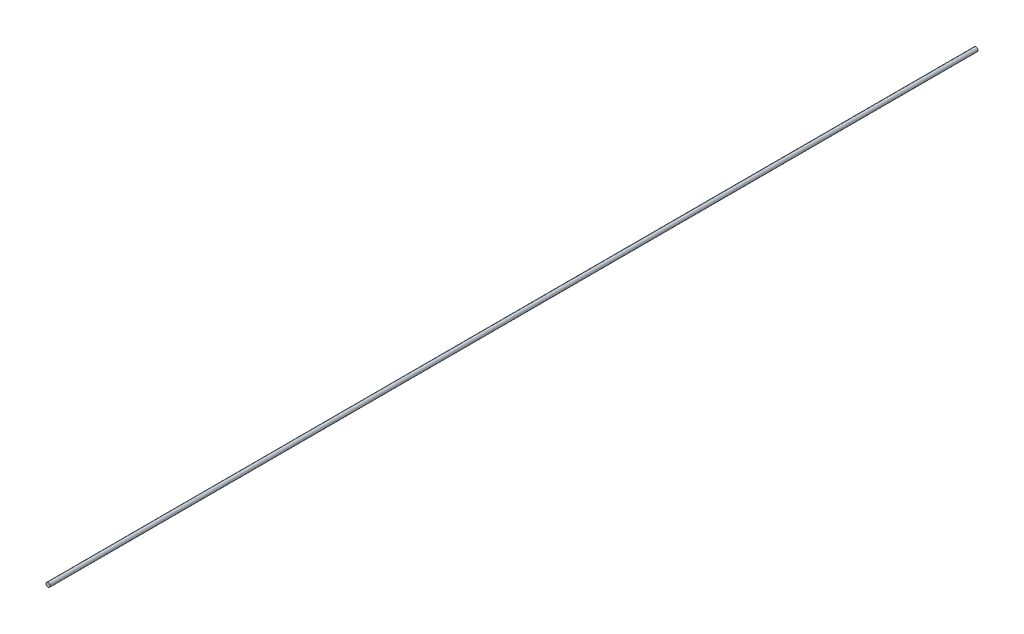
ISO-10303-21;
HEADER;
FILE_DESCRIPTION(('STEP AP214'),'2;1');
FILE_NAME('part.step','',(''),(''),'','','');
FILE_SCHEMA(('AUTOMOTIVE_DESIGN { 1 0 10303 214 1 1 1 1 }'));
ENDSEC;
DATA;
#1=APPLICATION_CONTEXT('core data for automotive mechanical design processes');
#2=APPLICATION_PROTOCOL_DEFINITION('international standard','automotive_design',2000,#1);
#3=PRODUCT_CONTEXT('',#1,'mechanical');
#4=PRODUCT('Part','Part','',(#3));
#5=PRODUCT_RELATED_PRODUCT_CATEGORY('part','',(#4));
#6=PRODUCT_DEFINITION_FORMATION('','',#4);
#7=PRODUCT_DEFINITION_CONTEXT('part definition',#1,'design');
#8=PRODUCT_DEFINITION('design','',#6,#7);
#9=PRODUCT_DEFINITION_SHAPE('','',#8);
#10=(LENGTH_UNIT() NAMED_UNIT(*) SI_UNIT(.MILLI.,.METRE.));
#11=(NAMED_UNIT(*) PLANE_ANGLE_UNIT() SI_UNIT($,.RADIAN.));
#12=(NAMED_UNIT(*) SI_UNIT($,.STERADIAN.) SOLID_ANGLE_UNIT());
#13=UNCERTAINTY_MEASURE_WITH_UNIT(LENGTH_MEASURE(1.E-05),#10,'distance_accuracy_value','');
#14=(GEOMETRIC_REPRESENTATION_CONTEXT(3) GLOBAL_UNCERTAINTY_ASSIGNED_CONTEXT((#13)) GLOBAL_UNIT_ASSIGNED_CONTEXT((#10,
#11,#12)) REPRESENTATION_CONTEXT('',''));
#15=CARTESIAN_POINT('',(0.,0.,0.));
#16=DIRECTION('',(0.,0.,1.));
#17=DIRECTION('',(1.,0.,0.));
#18=AXIS2_PLACEMENT_3D('',#15,#16,#17);
#19=CARTESIAN_POINT('',(0.,0.,900.));
#20=DIRECTION('',(0.,0.,-1.));
#21=DIRECTION('',(-1.,0.,0.));
#22=AXIS2_PLACEMENT_3D('',#19,#20,#21);
#23=CYLINDRICAL_SURFACE('',#22,2.);
#24=CARTESIAN_POINT('',(0.,0.,900.));
#25=DIRECTION('',(0.,0.,1.));
#26=DIRECTION('',(1.,0.,0.));
#27=AXIS2_PLACEMENT_3D('',#24,#25,#26);
#28=CIRCLE('',#27,2.);
#29=CARTESIAN_POINT('',(2.,0.,900.));
#30=VERTEX_POINT('',#29);
#31=EDGE_CURVE('E10',#30,#30,#28,.T.);
#32=ORIENTED_EDGE('',*,*,#31,.F.);
#33=EDGE_LOOP('',(#32));
#34=FACE_BOUND('',#33,.T.);
#35=CARTESIAN_POINT('',(0.,0.,0.));
#36=DIRECTION('',(0.,0.,1.));
#37=DIRECTION('',(1.,0.,0.));
#38=AXIS2_PLACEMENT_3D('',#35,#36,#37);
#39=CIRCLE('',#38,2.);
#40=CARTESIAN_POINT('',(2.,0.,0.));
#41=VERTEX_POINT('',#40);
#42=EDGE_CURVE('E38',#41,#41,#39,.T.);
#43=ORIENTED_EDGE('',*,*,#42,.T.);
#44=EDGE_LOOP('',(#43));
#45=FACE_BOUND('',#44,.T.);
#46=ADVANCED_FACE('F35',(#34,#45),#23,.T.);
#47=CARTESIAN_POINT('',(0.,0.,900.));
#48=DIRECTION('',(0.,0.,1.));
#49=DIRECTION('',(1.,0.,0.));
#50=AXIS2_PLACEMENT_3D('',#47,#48,#49);
#51=PLANE('',#50);
#52=ORIENTED_EDGE('',*,*,#31,.T.);
#53=EDGE_LOOP('',(#52));
#54=FACE_BOUND('',#53,.T.);
#55=ADVANCED_FACE('F50',(#54),#51,.T.);
#56=CARTESIAN_POINT('',(0.,0.,0.));
#57=DIRECTION('',(0.,0.,1.));
#58=DIRECTION('',(1.,0.,0.));
#59=AXIS2_PLACEMENT_3D('',#56,#57,#58);
#60=PLANE('',#59);
#61=ORIENTED_EDGE('',*,*,#42,.F.);
#62=EDGE_LOOP('',(#61));
#63=FACE_BOUND('',#62,.T.);
#64=ADVANCED_FACE('F48',(#63),#60,.F.);
#65=CLOSED_SHELL('',(#46,#55,#64));
#66=MANIFOLD_SOLID_BREP('B2',#65);
#67=ADVANCED_BREP_SHAPE_REPRESENTATION('',(#18,#66),#14);
#68=SHAPE_DEFINITION_REPRESENTATION(#9,#67);
ENDSEC;
END-ISO-10303-21;
